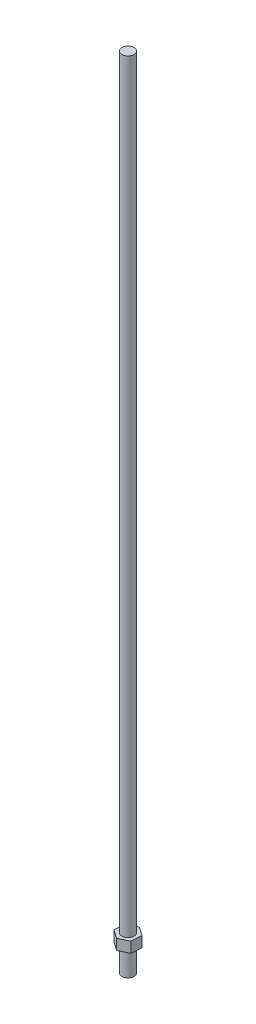
ISO-10303-21;
HEADER;
FILE_DESCRIPTION(('STEP AP214'),'2;1');
FILE_NAME('part.step','',(''),(''),'','','');
FILE_SCHEMA(('AUTOMOTIVE_DESIGN { 1 0 10303 214 1 1 1 1 }'));
ENDSEC;
DATA;
#1=APPLICATION_CONTEXT('core data for automotive mechanical design processes');
#2=APPLICATION_PROTOCOL_DEFINITION('international standard','automotive_design',2000,#1);
#3=PRODUCT_CONTEXT('',#1,'mechanical');
#4=PRODUCT('Part','Part','',(#3));
#5=PRODUCT_RELATED_PRODUCT_CATEGORY('part','',(#4));
#6=PRODUCT_DEFINITION_FORMATION('','',#4);
#7=PRODUCT_DEFINITION_CONTEXT('part definition',#1,'design');
#8=PRODUCT_DEFINITION('design','',#6,#7);
#9=PRODUCT_DEFINITION_SHAPE('','',#8);
#10=(LENGTH_UNIT() NAMED_UNIT(*) SI_UNIT(.MILLI.,.METRE.));
#11=(NAMED_UNIT(*) PLANE_ANGLE_UNIT() SI_UNIT($,.RADIAN.));
#12=(NAMED_UNIT(*) SI_UNIT($,.STERADIAN.) SOLID_ANGLE_UNIT());
#13=UNCERTAINTY_MEASURE_WITH_UNIT(LENGTH_MEASURE(1.E-05),#10,'distance_accuracy_value','');
#14=(GEOMETRIC_REPRESENTATION_CONTEXT(3) GLOBAL_UNCERTAINTY_ASSIGNED_CONTEXT((#13)) GLOBAL_UNIT_ASSIGNED_CONTEXT((#10,
#11,#12)) REPRESENTATION_CONTEXT('',''));
#15=CARTESIAN_POINT('',(0.,0.,0.));
#16=DIRECTION('',(0.,0.,1.));
#17=DIRECTION('',(1.,0.,0.));
#18=AXIS2_PLACEMENT_3D('',#15,#16,#17);
#19=CARTESIAN_POINT('',(0.,831.85,0.));
#20=DIRECTION('',(0.,-1.,0.));
#21=DIRECTION('',(0.,0.,-1.));
#22=AXIS2_PLACEMENT_3D('',#19,#20,#21);
#23=CYLINDRICAL_SURFACE('',#22,6.35);
#24=CARTESIAN_POINT('',(0.,36.449,0.));
#25=DIRECTION('',(0.,1.,0.));
#26=DIRECTION('',(0.,0.,1.));
#27=AXIS2_PLACEMENT_3D('',#24,#25,#26);
#28=CIRCLE('',#27,6.35);
#29=CARTESIAN_POINT('',(0.,36.4489999999998,-6.35));
#30=VERTEX_POINT('',#29);
#31=EDGE_CURVE('E35',#30,#30,#28,.T.);
#32=CARTESIAN_POINT('',(0.,831.85,0.));
#33=DIRECTION('',(0.,1.,0.));
#34=DIRECTION('',(0.,0.,1.));
#35=AXIS2_PLACEMENT_3D('',#32,#33,#34);
#36=CIRCLE('',#35,6.35);
#37=CARTESIAN_POINT('',(0.,831.85,-6.35));
#38=VERTEX_POINT('',#37);
#39=EDGE_CURVE('E41',#38,#38,#36,.T.);
#40=CARTESIAN_POINT('',(0.,36.4489999999998,-6.35));
#41=CARTESIAN_POINT('',(0.,44.7344270833332,-6.35));
#42=CARTESIAN_POINT('',(0.,53.0198541666665,-6.35));
#43=CARTESIAN_POINT('',(0.,69.5907083333332,-6.35));
#44=CARTESIAN_POINT('',(0.,77.8761354166665,-6.35));
#45=CARTESIAN_POINT('',(0.,94.4469895833332,-6.35));
#46=CARTESIAN_POINT('',(0.,102.732416666667,-6.35));
#47=CARTESIAN_POINT('',(0.,119.303270833333,-6.35));
#48=CARTESIAN_POINT('',(0.,127.588697916667,-6.35));
#49=CARTESIAN_POINT('',(0.,144.159552083333,-6.35));
#50=CARTESIAN_POINT('',(0.,152.444979166667,-6.35));
#51=CARTESIAN_POINT('',(0.,169.015833333333,-6.35));
#52=CARTESIAN_POINT('',(0.,177.301260416667,-6.35));
#53=CARTESIAN_POINT('',(0.,193.872114583333,-6.35));
#54=CARTESIAN_POINT('',(0.,202.157541666667,-6.35));
#55=CARTESIAN_POINT('',(0.,218.728395833333,-6.35));
#56=CARTESIAN_POINT('',(0.,227.013822916667,-6.35));
#57=CARTESIAN_POINT('',(0.,243.584677083333,-6.35));
#58=CARTESIAN_POINT('',(0.,251.870104166667,-6.35));
#59=CARTESIAN_POINT('',(0.,268.440958333333,-6.35));
#60=CARTESIAN_POINT('',(0.,276.726385416667,-6.35));
#61=CARTESIAN_POINT('',(0.,293.297239583333,-6.35));
#62=CARTESIAN_POINT('',(0.,301.582666666667,-6.35));
#63=CARTESIAN_POINT('',(0.,318.153520833333,-6.35));
#64=CARTESIAN_POINT('',(0.,326.438947916667,-6.35));
#65=CARTESIAN_POINT('',(0.,343.009802083333,-6.35));
#66=CARTESIAN_POINT('',(0.,351.295229166667,-6.35));
#67=CARTESIAN_POINT('',(0.,367.866083333333,-6.35));
#68=CARTESIAN_POINT('',(0.,376.151510416666,-6.35));
#69=CARTESIAN_POINT('',(0.,392.722364583333,-6.35));
#70=CARTESIAN_POINT('',(0.,401.007791666666,-6.35));
#71=CARTESIAN_POINT('',(0.,417.578645833333,-6.35));
#72=CARTESIAN_POINT('',(0.,425.864072916666,-6.35));
#73=CARTESIAN_POINT('',(0.,442.434927083333,-6.35));
#74=CARTESIAN_POINT('',(0.,450.720354166666,-6.35));
#75=CARTESIAN_POINT('',(0.,467.291208333333,-6.35));
#76=CARTESIAN_POINT('',(0.,475.576635416666,-6.35));
#77=CARTESIAN_POINT('',(0.,492.147489583333,-6.35));
#78=CARTESIAN_POINT('',(0.,500.432916666666,-6.35));
#79=CARTESIAN_POINT('',(0.,517.003770833333,-6.35));
#80=CARTESIAN_POINT('',(0.,525.289197916666,-6.35));
#81=CARTESIAN_POINT('',(0.,541.860052083333,-6.35));
#82=CARTESIAN_POINT('',(0.,550.145479166667,-6.35));
#83=CARTESIAN_POINT('',(0.,566.716333333333,-6.35));
#84=CARTESIAN_POINT('',(0.,575.001760416666,-6.35));
#85=CARTESIAN_POINT('',(0.,591.572614583333,-6.35));
#86=CARTESIAN_POINT('',(0.,599.858041666667,-6.35));
#87=CARTESIAN_POINT('',(0.,616.428895833333,-6.35));
#88=CARTESIAN_POINT('',(0.,624.714322916667,-6.35));
#89=CARTESIAN_POINT('',(0.,641.285177083333,-6.35));
#90=CARTESIAN_POINT('',(0.,649.570604166666,-6.35));
#91=CARTESIAN_POINT('',(0.,666.141458333333,-6.35));
#92=CARTESIAN_POINT('',(0.,674.426885416667,-6.35));
#93=CARTESIAN_POINT('',(0.,690.997739583333,-6.35));
#94=CARTESIAN_POINT('',(0.,699.283166666666,-6.35));
#95=CARTESIAN_POINT('',(0.,715.854020833333,-6.35));
#96=CARTESIAN_POINT('',(0.,724.139447916667,-6.35));
#97=CARTESIAN_POINT('',(0.,740.710302083333,-6.35));
#98=CARTESIAN_POINT('',(0.,748.995729166666,-6.35));
#99=CARTESIAN_POINT('',(0.,765.566583333333,-6.35));
#100=CARTESIAN_POINT('',(0.,773.852010416667,-6.35));
#101=CARTESIAN_POINT('',(0.,790.422864583333,-6.35));
#102=CARTESIAN_POINT('',(0.,798.708291666666,-6.35));
#103=CARTESIAN_POINT('',(0.,815.279145833333,-6.35));
#104=CARTESIAN_POINT('',(0.,823.564572916667,-6.35));
#105=CARTESIAN_POINT('',(0.,831.85,-6.35));
#106=B_SPLINE_CURVE_WITH_KNOTS('',3,(#40,#41,#42,#43,#44,#45,#46,#47,#48,#49,#50,#51,#52,#53,
#54,#55,#56,#57,#58,#59,#60,#61,#62,#63,#64,#65,#66,#67,#68,#69,#70,#71,#72,#73,#74,#75,#76,#77,
#78,#79,#80,#81,#82,#83,#84,#85,#86,#87,#88,#89,#90,#91,#92,#93,#94,#95,#96,#97,#98,#99,#100,
#101,#102,#103,#104,#105),.UNSPECIFIED.,.F.,.F.,(4,2,2,2,2,2,2,2,2,2,2,2,2,2,2,2,2,2,2,2,2,2,2,
2,2,2,2,2,2,2,2,2,4),(0.,24.8562812500001,49.7125625,74.5688437500001,99.425125,124.28140625,
149.1376875,173.99396875,198.85025,223.70653125,248.5628125,273.41909375,298.275375,
323.13165625,347.9879375,372.84421875,397.7005,422.55678125,447.4130625,472.26934375,497.125625,
521.98190625,546.8381875,571.69446875,596.55075,621.40703125,646.2633125,671.11959375,
695.975875,720.83215625,745.6884375,770.54471875,795.401),.UNSPECIFIED.);
#107=EDGE_CURVE('BSEAM32',#30,#38,#106,.T.);
#108=ORIENTED_EDGE('',*,*,#31,.T.);
#109=ORIENTED_EDGE('',*,*,#39,.F.);
#110=ORIENTED_EDGE('',*,*,#107,.T.);
#111=ORIENTED_EDGE('',*,*,#107,.F.);
#112=EDGE_LOOP('',(#108,#110,#109,#111));
#113=FACE_BOUND('',#112,.T.);
#114=ADVANCED_FACE('F32',(#113),#23,.T.);
#115=CARTESIAN_POINT('',(0.,831.85,0.));
#116=DIRECTION('',(0.,1.,0.));
#117=DIRECTION('',(0.,0.,1.));
#118=AXIS2_PLACEMENT_3D('',#115,#116,#117);
#119=PLANE('',#118);
#120=ORIENTED_EDGE('',*,*,#39,.T.);
#121=EDGE_LOOP('',(#120));
#122=FACE_BOUND('',#121,.T.);
#123=ADVANCED_FACE('F150',(#122),#119,.T.);
#124=CARTESIAN_POINT('',(0.,36.449,0.));
#125=DIRECTION('',(0.,1.,0.));
#126=DIRECTION('',(0.,0.,1.));
#127=AXIS2_PLACEMENT_3D('',#124,#125,#126);
#128=PLANE('',#127);
#129=DIRECTION('',(0.0679923661634542,0.,-0.99768584140675));
#130=VECTOR('',#129,1.);
#131=CARTESIAN_POINT('',(9.12904985050717,36.449,6.1341624389117));
#132=LINE('',#131,#130);
#133=CARTESIAN_POINT('',(9.12904985050717,36.449,6.1341624389117));
#134=VERTEX_POINT('',#133);
#135=CARTESIAN_POINT('',(9.87686542829142,36.449,-4.83890786349789));
#136=VERTEX_POINT('',#135);
#137=EDGE_CURVE('E129',#134,#136,#132,.T.);
#138=ORIENTED_EDGE('',*,*,#137,.T.);
#139=DIRECTION('',(-0.830025100572571,0.,-0.55772603706434));
#140=VECTOR('',#139,1.);
#141=CARTESIAN_POINT('',(9.87686542829142,36.449,-4.83890786349789));
#142=LINE('',#141,#140);
#143=CARTESIAN_POINT('',(0.747815577784257,36.449,-10.9730703024096));
#144=VERTEX_POINT('',#143);
#145=EDGE_CURVE('E87',#136,#144,#142,.T.);
#146=ORIENTED_EDGE('',*,*,#145,.T.);
#147=DIRECTION('',(-0.898017466736025,0.,0.43995980434241));
#148=VECTOR('',#147,1.);
#149=CARTESIAN_POINT('',(0.747815577784257,36.449,-10.9730703024096));
#150=LINE('',#149,#148);
#151=CARTESIAN_POINT('',(-9.12904985050717,36.449,-6.1341624389117));
#152=VERTEX_POINT('',#151);
#153=EDGE_CURVE('E101',#144,#152,#150,.T.);
#154=ORIENTED_EDGE('',*,*,#153,.T.);
#155=DIRECTION('',(-0.0679923661634545,0.,0.99768584140675));
#156=VECTOR('',#155,1.);
#157=CARTESIAN_POINT('',(-9.12904985050717,36.449,-6.1341624389117));
#158=LINE('',#157,#156);
#159=CARTESIAN_POINT('',(-9.87686542829143,36.449,4.83890786349789));
#160=VERTEX_POINT('',#159);
#161=EDGE_CURVE('E94',#152,#160,#158,.T.);
#162=ORIENTED_EDGE('',*,*,#161,.T.);
#163=DIRECTION('',(0.830025100572571,0.,0.55772603706434));
#164=VECTOR('',#163,1.);
#165=CARTESIAN_POINT('',(-9.87686542829143,36.449,4.83890786349789));
#166=LINE('',#165,#164);
#167=CARTESIAN_POINT('',(-0.747815577784261,36.449,10.9730703024096));
#168=VERTEX_POINT('',#167);
#169=EDGE_CURVE('E99',#160,#168,#166,.T.);
#170=ORIENTED_EDGE('',*,*,#169,.T.);
#171=DIRECTION('',(0.898017466736025,0.,-0.43995980434241));
#172=VECTOR('',#171,1.);
#173=CARTESIAN_POINT('',(-0.747815577784261,36.449,10.9730703024096));
#174=LINE('',#173,#172);
#175=EDGE_CURVE('E49',#168,#134,#174,.T.);
#176=ORIENTED_EDGE('',*,*,#175,.T.);
#177=EDGE_LOOP('',(#138,#146,#154,#162,#170,#176));
#178=FACE_BOUND('',#177,.T.);
#179=ORIENTED_EDGE('',*,*,#31,.F.);
#180=EDGE_LOOP('',(#179));
#181=FACE_BOUND('',#180,.T.);
#182=ADVANCED_FACE('F96',(#178,#181),#128,.T.);
#183=CARTESIAN_POINT('',(0.,25.4,0.));
#184=DIRECTION('',(0.,1.,0.));
#185=DIRECTION('',(0.,0.,1.));
#186=AXIS2_PLACEMENT_3D('',#183,#184,#185);
#187=PLANE('',#186);
#188=DIRECTION('',(0.0679923661634542,0.,-0.99768584140675));
#189=VECTOR('',#188,1.);
#190=CARTESIAN_POINT('',(9.12904985050717,25.4,6.1341624389117));
#191=LINE('',#190,#189);
#192=CARTESIAN_POINT('',(9.12904985050717,25.4,6.1341624389117));
#193=VERTEX_POINT('',#192);
#194=CARTESIAN_POINT('',(9.87686542829142,25.4,-4.83890786349789));
#195=VERTEX_POINT('',#194);
#196=EDGE_CURVE('E119',#193,#195,#191,.T.);
#197=ORIENTED_EDGE('',*,*,#196,.F.);
#198=DIRECTION('',(0.898017466736025,0.,-0.43995980434241));
#199=VECTOR('',#198,1.);
#200=CARTESIAN_POINT('',(-0.747815577784261,25.4,10.9730703024096));
#201=LINE('',#200,#199);
#202=CARTESIAN_POINT('',(-0.747815577784261,25.4,10.9730703024096));
#203=VERTEX_POINT('',#202);
#204=EDGE_CURVE('E78',#203,#193,#201,.T.);
#205=ORIENTED_EDGE('',*,*,#204,.F.);
#206=DIRECTION('',(0.830025100572571,0.,0.55772603706434));
#207=VECTOR('',#206,1.);
#208=CARTESIAN_POINT('',(-9.87686542829143,25.4,4.83890786349789));
#209=LINE('',#208,#207);
#210=CARTESIAN_POINT('',(-9.87686542829143,25.4,4.83890786349789));
#211=VERTEX_POINT('',#210);
#212=EDGE_CURVE('E72',#211,#203,#209,.T.);
#213=ORIENTED_EDGE('',*,*,#212,.F.);
#214=DIRECTION('',(-0.0679923661634545,0.,0.99768584140675));
#215=VECTOR('',#214,1.);
#216=CARTESIAN_POINT('',(-9.12904985050717,25.4,-6.1341624389117));
#217=LINE('',#216,#215);
#218=CARTESIAN_POINT('',(-9.12904985050717,25.4,-6.1341624389117));
#219=VERTEX_POINT('',#218);
#220=EDGE_CURVE('E109',#219,#211,#217,.T.);
#221=ORIENTED_EDGE('',*,*,#220,.F.);
#222=DIRECTION('',(-0.898017466736025,0.,0.43995980434241));
#223=VECTOR('',#222,1.);
#224=CARTESIAN_POINT('',(0.747815577784257,25.4,-10.9730703024096));
#225=LINE('',#224,#223);
#226=CARTESIAN_POINT('',(0.747815577784257,25.4,-10.9730703024096));
#227=VERTEX_POINT('',#226);
#228=EDGE_CURVE('E124',#227,#219,#225,.T.);
#229=ORIENTED_EDGE('',*,*,#228,.F.);
#230=DIRECTION('',(-0.830025100572571,0.,-0.55772603706434));
#231=VECTOR('',#230,1.);
#232=CARTESIAN_POINT('',(9.87686542829142,25.4,-4.83890786349789));
#233=LINE('',#232,#231);
#234=EDGE_CURVE('E122',#195,#227,#233,.T.);
#235=ORIENTED_EDGE('',*,*,#234,.F.);
#236=EDGE_LOOP('',(#197,#205,#213,#221,#229,#235));
#237=FACE_BOUND('',#236,.T.);
#238=CARTESIAN_POINT('',(0.,25.4,0.));
#239=DIRECTION('',(0.,1.,0.));
#240=DIRECTION('',(0.,0.,1.));
#241=AXIS2_PLACEMENT_3D('',#238,#239,#240);
#242=CIRCLE('',#241,6.35);
#243=CARTESIAN_POINT('',(0.,25.4,-6.35));
#244=VERTEX_POINT('',#243);
#245=EDGE_CURVE('E11',#244,#244,#242,.T.);
#246=ORIENTED_EDGE('',*,*,#245,.T.);
#247=EDGE_LOOP('',(#246));
#248=FACE_BOUND('',#247,.T.);
#249=ADVANCED_FACE('F149',(#237,#248),#187,.F.);
#250=CARTESIAN_POINT('',(9.12904985050717,36.449,6.1341624389117));
#251=DIRECTION('',(-0.99768584140675,0.,-0.0679923661634542));
#252=DIRECTION('',(-0.0679923661634542,0.,0.99768584140675));
#253=AXIS2_PLACEMENT_3D('',#250,#251,#252);
#254=PLANE('',#253);
#255=ORIENTED_EDGE('',*,*,#196,.T.);
#256=DIRECTION('',(0.,-1.,0.));
#257=VECTOR('',#256,1.);
#258=CARTESIAN_POINT('',(9.87686542829142,36.449,-4.83890786349789));
#259=LINE('',#258,#257);
#260=EDGE_CURVE('E136',#136,#195,#259,.T.);
#261=ORIENTED_EDGE('',*,*,#260,.F.);
#262=ORIENTED_EDGE('',*,*,#137,.F.);
#263=DIRECTION('',(0.,-1.,0.));
#264=VECTOR('',#263,1.);
#265=CARTESIAN_POINT('',(9.12904985050717,36.449,6.1341624389117));
#266=LINE('',#265,#264);
#267=EDGE_CURVE('E115',#134,#193,#266,.T.);
#268=ORIENTED_EDGE('',*,*,#267,.T.);
#269=EDGE_LOOP('',(#255,#261,#262,#268));
#270=FACE_BOUND('',#269,.T.);
#271=ADVANCED_FACE('F156',(#270),#254,.F.);
#272=CARTESIAN_POINT('',(9.87686542829142,36.449,-4.83890786349789));
#273=DIRECTION('',(-0.55772603706434,0.,0.830025100572571));
#274=DIRECTION('',(0.830025100572571,0.,0.55772603706434));
#275=AXIS2_PLACEMENT_3D('',#272,#273,#274);
#276=PLANE('',#275);
#277=ORIENTED_EDGE('',*,*,#234,.T.);
#278=DIRECTION('',(0.,-1.,0.));
#279=VECTOR('',#278,1.);
#280=CARTESIAN_POINT('',(0.747815577784257,36.449,-10.9730703024096));
#281=LINE('',#280,#279);
#282=EDGE_CURVE('E133',#144,#227,#281,.T.);
#283=ORIENTED_EDGE('',*,*,#282,.F.);
#284=ORIENTED_EDGE('',*,*,#145,.F.);
#285=ORIENTED_EDGE('',*,*,#260,.T.);
#286=EDGE_LOOP('',(#277,#283,#284,#285));
#287=FACE_BOUND('',#286,.T.);
#288=ADVANCED_FACE('F182',(#287),#276,.F.);
#289=CARTESIAN_POINT('',(0.747815577784257,36.449,-10.9730703024096));
#290=DIRECTION('',(0.43995980434241,0.,0.898017466736025));
#291=DIRECTION('',(0.898017466736025,0.,-0.43995980434241));
#292=AXIS2_PLACEMENT_3D('',#289,#290,#291);
#293=PLANE('',#292);
#294=ORIENTED_EDGE('',*,*,#228,.T.);
#295=DIRECTION('',(0.,-1.,0.));
#296=VECTOR('',#295,1.);
#297=CARTESIAN_POINT('',(-9.12904985050717,36.449,-6.1341624389117));
#298=LINE('',#297,#296);
#299=EDGE_CURVE('E110',#152,#219,#298,.T.);
#300=ORIENTED_EDGE('',*,*,#299,.F.);
#301=ORIENTED_EDGE('',*,*,#153,.F.);
#302=ORIENTED_EDGE('',*,*,#282,.T.);
#303=EDGE_LOOP('',(#294,#300,#301,#302));
#304=FACE_BOUND('',#303,.T.);
#305=ADVANCED_FACE('F186',(#304),#293,.F.);
#306=CARTESIAN_POINT('',(-9.12904985050717,36.449,-6.1341624389117));
#307=DIRECTION('',(0.99768584140675,0.,0.0679923661634545));
#308=DIRECTION('',(0.0679923661634545,0.,-0.99768584140675));
#309=AXIS2_PLACEMENT_3D('',#306,#307,#308);
#310=PLANE('',#309);
#311=ORIENTED_EDGE('',*,*,#220,.T.);
#312=DIRECTION('',(0.,-1.,0.));
#313=VECTOR('',#312,1.);
#314=CARTESIAN_POINT('',(-9.87686542829143,36.449,4.83890786349789));
#315=LINE('',#314,#313);
#316=EDGE_CURVE('E106',#160,#211,#315,.T.);
#317=ORIENTED_EDGE('',*,*,#316,.F.);
#318=ORIENTED_EDGE('',*,*,#161,.F.);
#319=ORIENTED_EDGE('',*,*,#299,.T.);
#320=EDGE_LOOP('',(#311,#317,#318,#319));
#321=FACE_BOUND('',#320,.T.);
#322=ADVANCED_FACE('F107',(#321),#310,.F.);
#323=CARTESIAN_POINT('',(-9.87686542829143,36.449,4.83890786349789));
#324=DIRECTION('',(0.55772603706434,0.,-0.830025100572571));
#325=DIRECTION('',(-0.830025100572571,0.,-0.55772603706434));
#326=AXIS2_PLACEMENT_3D('',#323,#324,#325);
#327=PLANE('',#326);
#328=ORIENTED_EDGE('',*,*,#212,.T.);
#329=DIRECTION('',(0.,-1.,0.));
#330=VECTOR('',#329,1.);
#331=CARTESIAN_POINT('',(-0.747815577784261,36.449,10.9730703024096));
#332=LINE('',#331,#330);
#333=EDGE_CURVE('E111',#168,#203,#332,.T.);
#334=ORIENTED_EDGE('',*,*,#333,.F.);
#335=ORIENTED_EDGE('',*,*,#169,.F.);
#336=ORIENTED_EDGE('',*,*,#316,.T.);
#337=EDGE_LOOP('',(#328,#334,#335,#336));
#338=FACE_BOUND('',#337,.T.);
#339=ADVANCED_FACE('F113',(#338),#327,.F.);
#340=CARTESIAN_POINT('',(-0.747815577784261,36.449,10.9730703024096));
#341=DIRECTION('',(-0.43995980434241,0.,-0.898017466736025));
#342=DIRECTION('',(-0.898017466736026,0.,0.43995980434241));
#343=AXIS2_PLACEMENT_3D('',#340,#341,#342);
#344=PLANE('',#343);
#345=ORIENTED_EDGE('',*,*,#204,.T.);
#346=ORIENTED_EDGE('',*,*,#267,.F.);
#347=ORIENTED_EDGE('',*,*,#175,.F.);
#348=ORIENTED_EDGE('',*,*,#333,.T.);
#349=EDGE_LOOP('',(#345,#346,#347,#348));
#350=FACE_BOUND('',#349,.T.);
#351=ADVANCED_FACE('F170',(#350),#344,.F.);
#352=CARTESIAN_POINT('',(0.,0.,0.));
#353=DIRECTION('',(0.,1.,0.));
#354=DIRECTION('',(0.,0.,1.));
#355=AXIS2_PLACEMENT_3D('',#352,#353,#354);
#356=PLANE('',#355);
#357=CARTESIAN_POINT('',(0.,0.,0.));
#358=DIRECTION('',(0.,1.,0.));
#359=DIRECTION('',(0.,0.,1.));
#360=AXIS2_PLACEMENT_3D('',#357,#358,#359);
#361=CIRCLE('',#360,6.35);
#362=CARTESIAN_POINT('',(0.,-1.11022302462516E-13,-6.35));
#363=VERTEX_POINT('',#362);
#364=EDGE_CURVE('E140',#363,#363,#361,.T.);
#365=ORIENTED_EDGE('',*,*,#364,.F.);
#366=EDGE_LOOP('',(#365));
#367=FACE_BOUND('',#366,.T.);
#368=ADVANCED_FACE('F166',(#367),#356,.F.);
#369=CARTESIAN_POINT('',(0.,-1.11022302462516E-13,-6.35));
#370=CARTESIAN_POINT('',(0.,0.264583333333235,-6.35));
#371=CARTESIAN_POINT('',(0.,0.529166666666581,-6.35));
#372=CARTESIAN_POINT('',(0.,1.05833333333324,-6.35));
#373=CARTESIAN_POINT('',(0.,1.32291666666654,-6.35));
#374=CARTESIAN_POINT('',(0.,1.8520833333332,-6.35));
#375=CARTESIAN_POINT('',(0.,2.11666666666654,-6.35));
#376=CARTESIAN_POINT('',(0.,2.64583333333324,-6.35));
#377=CARTESIAN_POINT('',(0.,2.91041666666658,-6.35));
#378=CARTESIAN_POINT('',(0.,3.43958333333324,-6.35));
#379=CARTESIAN_POINT('',(0.,3.70416666666655,-6.35));
#380=CARTESIAN_POINT('',(0.,4.2333333333332,-6.35));
#381=CARTESIAN_POINT('',(0.,4.49791666666655,-6.35));
#382=CARTESIAN_POINT('',(0.,5.02708333333324,-6.35));
#383=CARTESIAN_POINT('',(0.,5.29166666666658,-6.35));
#384=CARTESIAN_POINT('',(0.,5.82083333333328,-6.35));
#385=CARTESIAN_POINT('',(0.,6.08541666666662,-6.35));
#386=CARTESIAN_POINT('',(0.,6.61458333333328,-6.35));
#387=CARTESIAN_POINT('',(0.,6.87916666666658,-6.35));
#388=CARTESIAN_POINT('',(0.,7.40833333333324,-6.35));
#389=CARTESIAN_POINT('',(0.,7.67291666666658,-6.35));
#390=CARTESIAN_POINT('',(0.,8.20208333333328,-6.35));
#391=CARTESIAN_POINT('',(0.,8.46666666666662,-6.35));
#392=CARTESIAN_POINT('',(0.,8.99583333333328,-6.35));
#393=CARTESIAN_POINT('',(0.,9.26041666666659,-6.35));
#394=CARTESIAN_POINT('',(0.,9.78958333333324,-6.35));
#395=CARTESIAN_POINT('',(0.,10.0541666666666,-6.35));
#396=CARTESIAN_POINT('',(0.,10.5833333333333,-6.35));
#397=CARTESIAN_POINT('',(0.,10.8479166666666,-6.35));
#398=CARTESIAN_POINT('',(0.,11.3770833333333,-6.35));
#399=CARTESIAN_POINT('',(0.,11.6416666666666,-6.35));
#400=CARTESIAN_POINT('',(0.,12.1708333333332,-6.35));
#401=CARTESIAN_POINT('',(0.,12.4354166666666,-6.35));
#402=CARTESIAN_POINT('',(0.,12.9645833333333,-6.35));
#403=CARTESIAN_POINT('',(0.,13.2291666666666,-6.35));
#404=CARTESIAN_POINT('',(0.,13.7583333333333,-6.35));
#405=CARTESIAN_POINT('',(0.,14.0229166666666,-6.35));
#406=CARTESIAN_POINT('',(0.,14.5520833333332,-6.35));
#407=CARTESIAN_POINT('',(0.,14.8166666666666,-6.35));
#408=CARTESIAN_POINT('',(0.,15.3458333333333,-6.35));
#409=CARTESIAN_POINT('',(0.,15.6104166666666,-6.35));
#410=CARTESIAN_POINT('',(0.,16.1395833333333,-6.35));
#411=CARTESIAN_POINT('',(0.,16.4041666666666,-6.35));
#412=CARTESIAN_POINT('',(0.,16.9333333333332,-6.35));
#413=CARTESIAN_POINT('',(0.,17.1979166666666,-6.35));
#414=CARTESIAN_POINT('',(0.,17.7270833333333,-6.35));
#415=CARTESIAN_POINT('',(0.,17.9916666666666,-6.35));
#416=CARTESIAN_POINT('',(0.,18.5208333333333,-6.35));
#417=CARTESIAN_POINT('',(0.,18.7854166666666,-6.35));
#418=CARTESIAN_POINT('',(0.,19.3145833333332,-6.35));
#419=CARTESIAN_POINT('',(0.,19.5791666666666,-6.35));
#420=CARTESIAN_POINT('',(0.,20.1083333333333,-6.35));
#421=CARTESIAN_POINT('',(0.,20.3729166666666,-6.35));
#422=CARTESIAN_POINT('',(0.,20.9020833333333,-6.35));
#423=CARTESIAN_POINT('',(0.,21.1666666666667,-6.35));
#424=CARTESIAN_POINT('',(0.,21.6958333333333,-6.35));
#425=CARTESIAN_POINT('',(0.,21.9604166666666,-6.35));
#426=CARTESIAN_POINT('',(0.,22.4895833333333,-6.35));
#427=CARTESIAN_POINT('',(0.,22.7541666666666,-6.35));
#428=CARTESIAN_POINT('',(0.,23.2833333333333,-6.35));
#429=CARTESIAN_POINT('',(0.,23.5479166666667,-6.35));
#430=CARTESIAN_POINT('',(0.,24.0770833333333,-6.35));
#431=CARTESIAN_POINT('',(0.,24.3416666666666,-6.35));
#432=CARTESIAN_POINT('',(0.,24.8708333333333,-6.35));
#433=CARTESIAN_POINT('',(0.,25.1354166666666,-6.35));
#434=CARTESIAN_POINT('',(0.,25.4,-6.35));
#435=B_SPLINE_CURVE_WITH_KNOTS('',3,(#369,#370,#371,#372,#373,#374,#375,#376,#377,#378,#379,
#380,#381,#382,#383,#384,#385,#386,#387,#388,#389,#390,#391,#392,#393,#394,#395,#396,#397,#398,
#399,#400,#401,#402,#403,#404,#405,#406,#407,#408,#409,#410,#411,#412,#413,#414,#415,#416,#417,
#418,#419,#420,#421,#422,#423,#424,#425,#426,#427,#428,#429,#430,#431,#432,#433,#434),
.UNSPECIFIED.,.F.,.F.,(4,2,2,2,2,2,2,2,2,2,2,2,2,2,2,2,2,2,2,2,2,2,2,2,2,2,2,2,2,2,2,2,4),(0.,
0.793750000000037,1.58749999999996,2.38125,3.17500000000004,3.96874999999997,4.7625,
5.55625000000004,6.35000000000008,7.14375,7.93750000000004,8.73125000000008,9.52500000000001,
10.31875,11.1125000000001,11.90625,12.7,13.4937500000001,14.2875,15.08125,15.8750000000001,
16.66875,17.4625,18.2562500000001,19.05,19.84375,20.6375000000001,21.4312500000001,
22.2250000000001,23.0187500000001,23.8125000000001,24.6062500000001,25.4000000000001),.UNSPECIFIED.);
#436=EDGE_CURVE('BSEAM162',#363,#244,#435,.T.);
#437=ORIENTED_EDGE('',*,*,#364,.T.);
#438=ORIENTED_EDGE('',*,*,#245,.F.);
#439=ORIENTED_EDGE('',*,*,#436,.T.);
#440=ORIENTED_EDGE('',*,*,#436,.F.);
#441=EDGE_LOOP('',(#437,#439,#438,#440));
#442=FACE_BOUND('',#441,.T.);
#443=ADVANCED_FACE('F162',(#442),#23,.T.);
#444=CLOSED_SHELL('',(#114,#123,#182,#249,#271,#288,#305,#322,#339,#351,#368,#443));
#445=MANIFOLD_SOLID_BREP('B2',#444);
#446=ADVANCED_BREP_SHAPE_REPRESENTATION('',(#18,#445),#14);
#447=SHAPE_DEFINITION_REPRESENTATION(#9,#446);
ENDSEC;
END-ISO-10303-21;
